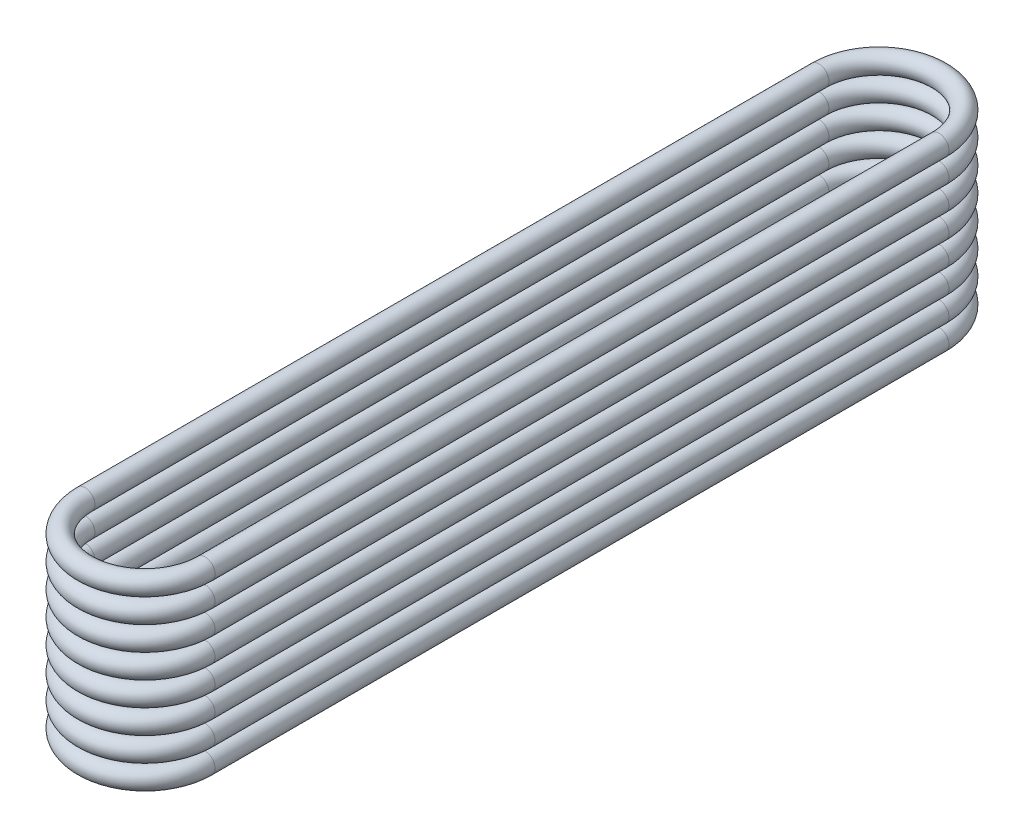
ISO-10303-21;
HEADER;
FILE_DESCRIPTION(('STEP AP214'),'2;1');
FILE_NAME('part.step','',(''),(''),'','','');
FILE_SCHEMA(('AUTOMOTIVE_DESIGN { 1 0 10303 214 1 1 1 1 }'));
ENDSEC;
DATA;
#1=APPLICATION_CONTEXT('core data for automotive mechanical design processes');
#2=APPLICATION_PROTOCOL_DEFINITION('international standard','automotive_design',2000,#1);
#3=PRODUCT_CONTEXT('',#1,'mechanical');
#4=PRODUCT('Part','Part','',(#3));
#5=PRODUCT_RELATED_PRODUCT_CATEGORY('part','',(#4));
#6=PRODUCT_DEFINITION_FORMATION('','',#4);
#7=PRODUCT_DEFINITION_CONTEXT('part definition',#1,'design');
#8=PRODUCT_DEFINITION('design','',#6,#7);
#9=PRODUCT_DEFINITION_SHAPE('','',#8);
#10=(LENGTH_UNIT() NAMED_UNIT(*) SI_UNIT(.MILLI.,.METRE.));
#11=(NAMED_UNIT(*) PLANE_ANGLE_UNIT() SI_UNIT($,.RADIAN.));
#12=(NAMED_UNIT(*) SI_UNIT($,.STERADIAN.) SOLID_ANGLE_UNIT());
#13=UNCERTAINTY_MEASURE_WITH_UNIT(LENGTH_MEASURE(1.E-05),#10,'distance_accuracy_value','');
#14=(GEOMETRIC_REPRESENTATION_CONTEXT(3) GLOBAL_UNCERTAINTY_ASSIGNED_CONTEXT((#13)) GLOBAL_UNIT_ASSIGNED_CONTEXT((#10,
#11,#12)) REPRESENTATION_CONTEXT('',''));
#15=CARTESIAN_POINT('',(0.,0.,0.));
#16=DIRECTION('',(0.,0.,1.));
#17=DIRECTION('',(1.,0.,0.));
#18=AXIS2_PLACEMENT_3D('',#15,#16,#17);
#19=CARTESIAN_POINT('',(2.28600000003875,-0.9144,0.));
#20=DIRECTION('',(0.,0.,-1.));
#21=DIRECTION('',(-1.,0.,0.));
#22=AXIS2_PLACEMENT_3D('',#19,#20,#21);
#23=CYLINDRICAL_SURFACE('',#22,0.381);
#24=CARTESIAN_POINT('',(2.28600000003875,-0.9144,-27.94));
#25=DIRECTION('',(0.,0.,1.));
#26=DIRECTION('',(1.,0.,0.));
#27=AXIS2_PLACEMENT_3D('',#24,#25,#26);
#28=CIRCLE('',#27,0.381);
#29=CARTESIAN_POINT('',(2.66700000003876,-0.9144,-27.94));
#30=VERTEX_POINT('',#29);
#31=EDGE_CURVE('P0_E47',#30,#30,#28,.T.);
#32=ORIENTED_EDGE('',*,*,#31,.T.);
#33=EDGE_LOOP('',(#32));
#34=FACE_BOUND('',#33,.T.);
#35=CARTESIAN_POINT('',(2.28600000003875,-0.9144,0.));
#36=DIRECTION('',(0.,0.,1.));
#37=DIRECTION('',(1.,0.,0.));
#38=AXIS2_PLACEMENT_3D('',#35,#36,#37);
#39=CIRCLE('',#38,0.381);
#40=CARTESIAN_POINT('',(2.66700000003874,-0.9144,0.));
#41=VERTEX_POINT('',#40);
#42=EDGE_CURVE('P0_E11',#41,#41,#39,.T.);
#43=ORIENTED_EDGE('',*,*,#42,.F.);
#44=EDGE_LOOP('',(#43));
#45=FACE_BOUND('',#44,.T.);
#46=ADVANCED_FACE('P0_F17',(#34,#45),#23,.T.);
#47=CARTESIAN_POINT('',(0.,-0.9144,0.));
#48=DIRECTION('',(0.,1.,0.));
#49=DIRECTION('',(0.,0.,1.));
#50=AXIS2_PLACEMENT_3D('',#47,#48,#49);
#51=TOROIDAL_SURFACE('',#50,2.28600000003875,0.381);
#52=ORIENTED_EDGE('',*,*,#42,.T.);
#53=EDGE_LOOP('',(#52));
#54=FACE_BOUND('',#53,.T.);
#55=CARTESIAN_POINT('',(-2.28600000003875,-0.9144,0.));
#56=DIRECTION('',(0.,0.,-1.));
#57=DIRECTION('',(-1.,0.,0.));
#58=AXIS2_PLACEMENT_3D('',#55,#56,#57);
#59=CIRCLE('',#58,0.381);
#60=CARTESIAN_POINT('',(-2.66700000003874,-0.9144,0.));
#61=VERTEX_POINT('',#60);
#62=EDGE_CURVE('P0_E28',#61,#61,#59,.T.);
#63=ORIENTED_EDGE('',*,*,#62,.F.);
#64=EDGE_LOOP('',(#63));
#65=FACE_BOUND('',#64,.T.);
#66=ADVANCED_FACE('P0_F69',(#54,#65),#51,.T.);
#67=CARTESIAN_POINT('',(-2.28600000003875,-0.9144,0.));
#68=DIRECTION('',(0.,0.,-1.));
#69=DIRECTION('',(-1.,0.,0.));
#70=AXIS2_PLACEMENT_3D('',#67,#68,#69);
#71=CYLINDRICAL_SURFACE('',#70,0.381);
#72=CARTESIAN_POINT('',(-2.28600000003875,-0.9144,-27.94));
#73=DIRECTION('',(0.,0.,-1.));
#74=DIRECTION('',(-1.,0.,0.));
#75=AXIS2_PLACEMENT_3D('',#72,#73,#74);
#76=CIRCLE('',#75,0.381);
#77=CARTESIAN_POINT('',(-2.66700000003874,-0.9144,-27.94));
#78=VERTEX_POINT('',#77);
#79=EDGE_CURVE('P0_E21',#78,#78,#76,.T.);
#80=ORIENTED_EDGE('',*,*,#79,.F.);
#81=EDGE_LOOP('',(#80));
#82=FACE_BOUND('',#81,.T.);
#83=ORIENTED_EDGE('',*,*,#62,.T.);
#84=EDGE_LOOP('',(#83));
#85=FACE_BOUND('',#84,.T.);
#86=ADVANCED_FACE('P0_F19',(#82,#85),#71,.T.);
#87=CARTESIAN_POINT('',(0.,-0.9144,-27.94));
#88=DIRECTION('',(0.,-1.,0.));
#89=DIRECTION('',(0.,0.,-1.));
#90=AXIS2_PLACEMENT_3D('',#87,#88,#89);
#91=TOROIDAL_SURFACE('',#90,2.28600000003875,0.381);
#92=ORIENTED_EDGE('',*,*,#31,.F.);
#93=EDGE_LOOP('',(#92));
#94=FACE_BOUND('',#93,.T.);
#95=ORIENTED_EDGE('',*,*,#79,.T.);
#96=EDGE_LOOP('',(#95));
#97=FACE_BOUND('',#96,.T.);
#98=ADVANCED_FACE('P0_F53',(#94,#97),#91,.T.);
#99=CLOSED_SHELL('',(#46,#66,#86,#98));
#100=MANIFOLD_SOLID_BREP('P0_B1',#99);
#101=CARTESIAN_POINT('',(2.28600000003875,-3.6576,0.));
#102=DIRECTION('',(0.,0.,-1.));
#103=DIRECTION('',(-1.,0.,0.));
#104=AXIS2_PLACEMENT_3D('',#101,#102,#103);
#105=CYLINDRICAL_SURFACE('',#104,0.381);
#106=CARTESIAN_POINT('',(2.28600000003875,-3.6576,-27.94));
#107=DIRECTION('',(0.,0.,1.));
#108=DIRECTION('',(1.,0.,0.));
#109=AXIS2_PLACEMENT_3D('',#106,#107,#108);
#110=CIRCLE('',#109,0.381);
#111=CARTESIAN_POINT('',(2.66700000003876,-3.6576,-27.94));
#112=VERTEX_POINT('',#111);
#113=EDGE_CURVE('P1_E21',#112,#112,#110,.T.);
#114=ORIENTED_EDGE('',*,*,#113,.T.);
#115=EDGE_LOOP('',(#114));
#116=FACE_BOUND('',#115,.T.);
#117=CARTESIAN_POINT('',(2.28600000003875,-3.6576,0.));
#118=DIRECTION('',(0.,0.,1.));
#119=DIRECTION('',(1.,0.,0.));
#120=AXIS2_PLACEMENT_3D('',#117,#118,#119);
#121=CIRCLE('',#120,0.381);
#122=CARTESIAN_POINT('',(2.66700000003874,-3.6576,0.));
#123=VERTEX_POINT('',#122);
#124=EDGE_CURVE('P1_E11',#123,#123,#121,.T.);
#125=ORIENTED_EDGE('',*,*,#124,.F.);
#126=EDGE_LOOP('',(#125));
#127=FACE_BOUND('',#126,.T.);
#128=ADVANCED_FACE('P1_F17',(#116,#127),#105,.T.);
#129=CARTESIAN_POINT('',(0.,-3.6576,0.));
#130=DIRECTION('',(0.,1.,0.));
#131=DIRECTION('',(0.,0.,1.));
#132=AXIS2_PLACEMENT_3D('',#129,#130,#131);
#133=TOROIDAL_SURFACE('',#132,2.28600000003875,0.381);
#134=ORIENTED_EDGE('',*,*,#124,.T.);
#135=EDGE_LOOP('',(#134));
#136=FACE_BOUND('',#135,.T.);
#137=CARTESIAN_POINT('',(-2.28600000003875,-3.6576,0.));
#138=DIRECTION('',(0.,0.,-1.));
#139=DIRECTION('',(-1.,0.,0.));
#140=AXIS2_PLACEMENT_3D('',#137,#138,#139);
#141=CIRCLE('',#140,0.381);
#142=CARTESIAN_POINT('',(-2.66700000003874,-3.6576,0.));
#143=VERTEX_POINT('',#142);
#144=EDGE_CURVE('P1_E28',#143,#143,#141,.T.);
#145=ORIENTED_EDGE('',*,*,#144,.F.);
#146=EDGE_LOOP('',(#145));
#147=FACE_BOUND('',#146,.T.);
#148=ADVANCED_FACE('P1_F68',(#136,#147),#133,.T.);
#149=CARTESIAN_POINT('',(-2.28600000003875,-3.6576,0.));
#150=DIRECTION('',(0.,0.,-1.));
#151=DIRECTION('',(-1.,0.,0.));
#152=AXIS2_PLACEMENT_3D('',#149,#150,#151);
#153=CYLINDRICAL_SURFACE('',#152,0.381);
#154=CARTESIAN_POINT('',(-2.28600000003875,-3.6576,-27.94));
#155=DIRECTION('',(0.,0.,-1.));
#156=DIRECTION('',(-1.,0.,0.));
#157=AXIS2_PLACEMENT_3D('',#154,#155,#156);
#158=CIRCLE('',#157,0.381);
#159=CARTESIAN_POINT('',(-2.66700000003874,-3.6576,-27.94));
#160=VERTEX_POINT('',#159);
#161=EDGE_CURVE('P1_E52',#160,#160,#158,.T.);
#162=ORIENTED_EDGE('',*,*,#161,.F.);
#163=EDGE_LOOP('',(#162));
#164=FACE_BOUND('',#163,.T.);
#165=ORIENTED_EDGE('',*,*,#144,.T.);
#166=EDGE_LOOP('',(#165));
#167=FACE_BOUND('',#166,.T.);
#168=ADVANCED_FACE('P1_F66',(#164,#167),#153,.T.);
#169=CARTESIAN_POINT('',(0.,-3.6576,-27.94));
#170=DIRECTION('',(0.,-1.,0.));
#171=DIRECTION('',(0.,0.,-1.));
#172=AXIS2_PLACEMENT_3D('',#169,#170,#171);
#173=TOROIDAL_SURFACE('',#172,2.28600000003875,0.381);
#174=ORIENTED_EDGE('',*,*,#113,.F.);
#175=EDGE_LOOP('',(#174));
#176=FACE_BOUND('',#175,.T.);
#177=ORIENTED_EDGE('',*,*,#161,.T.);
#178=EDGE_LOOP('',(#177));
#179=FACE_BOUND('',#178,.T.);
#180=ADVANCED_FACE('P1_F19',(#176,#179),#173,.T.);
#181=CLOSED_SHELL('',(#128,#148,#168,#180));
#182=MANIFOLD_SOLID_BREP('P1_B1',#181);
#183=CARTESIAN_POINT('',(2.28600000003875,-1.8288,0.));
#184=DIRECTION('',(0.,0.,-1.));
#185=DIRECTION('',(-1.,0.,0.));
#186=AXIS2_PLACEMENT_3D('',#183,#184,#185);
#187=CYLINDRICAL_SURFACE('',#186,0.381);
#188=CARTESIAN_POINT('',(2.28600000003875,-1.8288,-27.94));
#189=DIRECTION('',(0.,0.,1.));
#190=DIRECTION('',(1.,0.,0.));
#191=AXIS2_PLACEMENT_3D('',#188,#189,#190);
#192=CIRCLE('',#191,0.381);
#193=CARTESIAN_POINT('',(2.66700000003876,-1.8288,-27.94));
#194=VERTEX_POINT('',#193);
#195=EDGE_CURVE('P2_E44',#194,#194,#192,.T.);
#196=ORIENTED_EDGE('',*,*,#195,.T.);
#197=EDGE_LOOP('',(#196));
#198=FACE_BOUND('',#197,.T.);
#199=CARTESIAN_POINT('',(2.28600000003875,-1.8288,0.));
#200=DIRECTION('',(0.,0.,1.));
#201=DIRECTION('',(1.,0.,0.));
#202=AXIS2_PLACEMENT_3D('',#199,#200,#201);
#203=CIRCLE('',#202,0.381);
#204=CARTESIAN_POINT('',(2.66700000003874,-1.8288,0.));
#205=VERTEX_POINT('',#204);
#206=EDGE_CURVE('P2_E11',#205,#205,#203,.T.);
#207=ORIENTED_EDGE('',*,*,#206,.F.);
#208=EDGE_LOOP('',(#207));
#209=FACE_BOUND('',#208,.T.);
#210=ADVANCED_FACE('P2_F17',(#198,#209),#187,.T.);
#211=CARTESIAN_POINT('',(0.,-1.8288,0.));
#212=DIRECTION('',(0.,1.,0.));
#213=DIRECTION('',(0.,0.,1.));
#214=AXIS2_PLACEMENT_3D('',#211,#212,#213);
#215=TOROIDAL_SURFACE('',#214,2.28600000003875,0.381);
#216=ORIENTED_EDGE('',*,*,#206,.T.);
#217=EDGE_LOOP('',(#216));
#218=FACE_BOUND('',#217,.T.);
#219=CARTESIAN_POINT('',(-2.28600000003875,-1.8288,0.));
#220=DIRECTION('',(0.,0.,-1.));
#221=DIRECTION('',(-1.,0.,0.));
#222=AXIS2_PLACEMENT_3D('',#219,#220,#221);
#223=CIRCLE('',#222,0.381);
#224=CARTESIAN_POINT('',(-2.66700000003874,-1.8288,0.));
#225=VERTEX_POINT('',#224);
#226=EDGE_CURVE('P2_E20',#225,#225,#223,.T.);
#227=ORIENTED_EDGE('',*,*,#226,.F.);
#228=EDGE_LOOP('',(#227));
#229=FACE_BOUND('',#228,.T.);
#230=ADVANCED_FACE('P2_F69',(#218,#229),#215,.T.);
#231=CARTESIAN_POINT('',(-2.28600000003875,-1.8288,0.));
#232=DIRECTION('',(0.,0.,-1.));
#233=DIRECTION('',(-1.,0.,0.));
#234=AXIS2_PLACEMENT_3D('',#231,#232,#233);
#235=CYLINDRICAL_SURFACE('',#234,0.381);
#236=CARTESIAN_POINT('',(-2.28600000003875,-1.8288,-27.94));
#237=DIRECTION('',(0.,0.,-1.));
#238=DIRECTION('',(-1.,0.,0.));
#239=AXIS2_PLACEMENT_3D('',#236,#237,#238);
#240=CIRCLE('',#239,0.381);
#241=CARTESIAN_POINT('',(-2.66700000003874,-1.8288,-27.94));
#242=VERTEX_POINT('',#241);
#243=EDGE_CURVE('P2_E50',#242,#242,#240,.T.);
#244=ORIENTED_EDGE('',*,*,#243,.F.);
#245=EDGE_LOOP('',(#244));
#246=FACE_BOUND('',#245,.T.);
#247=ORIENTED_EDGE('',*,*,#226,.T.);
#248=EDGE_LOOP('',(#247));
#249=FACE_BOUND('',#248,.T.);
#250=ADVANCED_FACE('P2_F67',(#246,#249),#235,.T.);
#251=CARTESIAN_POINT('',(0.,-1.8288,-27.94));
#252=DIRECTION('',(0.,-1.,0.));
#253=DIRECTION('',(0.,0.,-1.));
#254=AXIS2_PLACEMENT_3D('',#251,#252,#253);
#255=TOROIDAL_SURFACE('',#254,2.28600000003875,0.381);
#256=ORIENTED_EDGE('',*,*,#195,.F.);
#257=EDGE_LOOP('',(#256));
#258=FACE_BOUND('',#257,.T.);
#259=ORIENTED_EDGE('',*,*,#243,.T.);
#260=EDGE_LOOP('',(#259));
#261=FACE_BOUND('',#260,.T.);
#262=ADVANCED_FACE('P2_F51',(#258,#261),#255,.T.);
#263=CLOSED_SHELL('',(#210,#230,#250,#262));
#264=MANIFOLD_SOLID_BREP('P2_B1',#263);
#265=CARTESIAN_POINT('',(2.28600000003875,-5.4864,0.));
#266=DIRECTION('',(0.,0.,-1.));
#267=DIRECTION('',(-1.,0.,0.));
#268=AXIS2_PLACEMENT_3D('',#265,#266,#267);
#269=CYLINDRICAL_SURFACE('',#268,0.381);
#270=CARTESIAN_POINT('',(2.28600000003875,-5.4864,-27.94));
#271=DIRECTION('',(0.,0.,1.));
#272=DIRECTION('',(1.,0.,0.));
#273=AXIS2_PLACEMENT_3D('',#270,#271,#272);
#274=CIRCLE('',#273,0.381);
#275=CARTESIAN_POINT('',(2.66700000003876,-5.4864,-27.94));
#276=VERTEX_POINT('',#275);
#277=EDGE_CURVE('P3_E51',#276,#276,#274,.T.);
#278=ORIENTED_EDGE('',*,*,#277,.T.);
#279=EDGE_LOOP('',(#278));
#280=FACE_BOUND('',#279,.T.);
#281=CARTESIAN_POINT('',(2.28600000003875,-5.4864,0.));
#282=DIRECTION('',(0.,0.,1.));
#283=DIRECTION('',(1.,0.,0.));
#284=AXIS2_PLACEMENT_3D('',#281,#282,#283);
#285=CIRCLE('',#284,0.381);
#286=CARTESIAN_POINT('',(2.66700000003874,-5.4864,0.));
#287=VERTEX_POINT('',#286);
#288=EDGE_CURVE('P3_E11',#287,#287,#285,.T.);
#289=ORIENTED_EDGE('',*,*,#288,.F.);
#290=EDGE_LOOP('',(#289));
#291=FACE_BOUND('',#290,.T.);
#292=ADVANCED_FACE('P3_F17',(#280,#291),#269,.T.);
#293=CARTESIAN_POINT('',(0.,-5.4864,0.));
#294=DIRECTION('',(0.,1.,0.));
#295=DIRECTION('',(0.,0.,1.));
#296=AXIS2_PLACEMENT_3D('',#293,#294,#295);
#297=TOROIDAL_SURFACE('',#296,2.28600000003875,0.381);
#298=ORIENTED_EDGE('',*,*,#288,.T.);
#299=EDGE_LOOP('',(#298));
#300=FACE_BOUND('',#299,.T.);
#301=CARTESIAN_POINT('',(-2.28600000003875,-5.4864,0.));
#302=DIRECTION('',(0.,0.,-1.));
#303=DIRECTION('',(-1.,0.,0.));
#304=AXIS2_PLACEMENT_3D('',#301,#302,#303);
#305=CIRCLE('',#304,0.381);
#306=CARTESIAN_POINT('',(-2.66700000003874,-5.4864,0.));
#307=VERTEX_POINT('',#306);
#308=EDGE_CURVE('P3_E27',#307,#307,#305,.T.);
#309=ORIENTED_EDGE('',*,*,#308,.F.);
#310=EDGE_LOOP('',(#309));
#311=FACE_BOUND('',#310,.T.);
#312=ADVANCED_FACE('P3_F19',(#300,#311),#297,.T.);
#313=CARTESIAN_POINT('',(-2.28600000003875,-5.4864,0.));
#314=DIRECTION('',(0.,0.,-1.));
#315=DIRECTION('',(-1.,0.,0.));
#316=AXIS2_PLACEMENT_3D('',#313,#314,#315);
#317=CYLINDRICAL_SURFACE('',#316,0.381);
#318=CARTESIAN_POINT('',(-2.28600000003875,-5.4864,-27.94));
#319=DIRECTION('',(0.,0.,-1.));
#320=DIRECTION('',(-1.,0.,0.));
#321=AXIS2_PLACEMENT_3D('',#318,#319,#320);
#322=CIRCLE('',#321,0.381);
#323=CARTESIAN_POINT('',(-2.66700000003874,-5.4864,-27.94));
#324=VERTEX_POINT('',#323);
#325=EDGE_CURVE('P3_E47',#324,#324,#322,.T.);
#326=ORIENTED_EDGE('',*,*,#325,.F.);
#327=EDGE_LOOP('',(#326));
#328=FACE_BOUND('',#327,.T.);
#329=ORIENTED_EDGE('',*,*,#308,.T.);
#330=EDGE_LOOP('',(#329));
#331=FACE_BOUND('',#330,.T.);
#332=ADVANCED_FACE('P3_F63',(#328,#331),#317,.T.);
#333=CARTESIAN_POINT('',(0.,-5.4864,-27.94));
#334=DIRECTION('',(0.,-1.,0.));
#335=DIRECTION('',(0.,0.,-1.));
#336=AXIS2_PLACEMENT_3D('',#333,#334,#335);
#337=TOROIDAL_SURFACE('',#336,2.28600000003875,0.381);
#338=ORIENTED_EDGE('',*,*,#277,.F.);
#339=EDGE_LOOP('',(#338));
#340=FACE_BOUND('',#339,.T.);
#341=ORIENTED_EDGE('',*,*,#325,.T.);
#342=EDGE_LOOP('',(#341));
#343=FACE_BOUND('',#342,.T.);
#344=ADVANCED_FACE('P3_F48',(#340,#343),#337,.T.);
#345=CLOSED_SHELL('',(#292,#312,#332,#344));
#346=MANIFOLD_SOLID_BREP('P3_B1',#345);
#347=CARTESIAN_POINT('',(2.28600000003875,0.,0.));
#348=DIRECTION('',(0.,0.,-1.));
#349=DIRECTION('',(-1.,0.,0.));
#350=AXIS2_PLACEMENT_3D('',#347,#348,#349);
#351=CYLINDRICAL_SURFACE('',#350,0.381);
#352=CARTESIAN_POINT('',(2.28600000003875,0.,-27.94));
#353=DIRECTION('',(0.,0.,1.));
#354=DIRECTION('',(1.,0.,0.));
#355=AXIS2_PLACEMENT_3D('',#352,#353,#354);
#356=CIRCLE('',#355,0.381);
#357=CARTESIAN_POINT('',(2.66700000003876,0.,-27.94));
#358=VERTEX_POINT('',#357);
#359=EDGE_CURVE('P4_E21',#358,#358,#356,.T.);
#360=ORIENTED_EDGE('',*,*,#359,.T.);
#361=EDGE_LOOP('',(#360));
#362=FACE_BOUND('',#361,.T.);
#363=CARTESIAN_POINT('',(2.28600000003875,0.,0.));
#364=DIRECTION('',(0.,0.,1.));
#365=DIRECTION('',(1.,0.,0.));
#366=AXIS2_PLACEMENT_3D('',#363,#364,#365);
#367=CIRCLE('',#366,0.381);
#368=CARTESIAN_POINT('',(2.66700000003874,0.,0.));
#369=VERTEX_POINT('',#368);
#370=EDGE_CURVE('P4_E11',#369,#369,#367,.T.);
#371=ORIENTED_EDGE('',*,*,#370,.F.);
#372=EDGE_LOOP('',(#371));
#373=FACE_BOUND('',#372,.T.);
#374=ADVANCED_FACE('P4_F17',(#362,#373),#351,.T.);
#375=CARTESIAN_POINT('',(0.,0.,0.));
#376=DIRECTION('',(0.,1.,0.));
#377=DIRECTION('',(0.,0.,1.));
#378=AXIS2_PLACEMENT_3D('',#375,#376,#377);
#379=TOROIDAL_SURFACE('',#378,2.28600000003875,0.381);
#380=ORIENTED_EDGE('',*,*,#370,.T.);
#381=EDGE_LOOP('',(#380));
#382=FACE_BOUND('',#381,.T.);
#383=CARTESIAN_POINT('',(-2.28600000003875,0.,0.));
#384=DIRECTION('',(0.,0.,-1.));
#385=DIRECTION('',(-1.,0.,0.));
#386=AXIS2_PLACEMENT_3D('',#383,#384,#385);
#387=CIRCLE('',#386,0.381);
#388=CARTESIAN_POINT('',(-2.66700000003874,0.,0.));
#389=VERTEX_POINT('',#388);
#390=EDGE_CURVE('P4_E27',#389,#389,#387,.T.);
#391=ORIENTED_EDGE('',*,*,#390,.F.);
#392=EDGE_LOOP('',(#391));
#393=FACE_BOUND('',#392,.T.);
#394=ADVANCED_FACE('P4_F79',(#382,#393),#379,.T.);
#395=CARTESIAN_POINT('',(-2.28600000003875,0.,0.));
#396=DIRECTION('',(0.,0.,-1.));
#397=DIRECTION('',(-1.,0.,0.));
#398=AXIS2_PLACEMENT_3D('',#395,#396,#397);
#399=CYLINDRICAL_SURFACE('',#398,0.381);
#400=CARTESIAN_POINT('',(-2.28600000003875,0.,-27.94));
#401=DIRECTION('',(0.,0.,-1.));
#402=DIRECTION('',(-1.,0.,0.));
#403=AXIS2_PLACEMENT_3D('',#400,#401,#402);
#404=CIRCLE('',#403,0.381);
#405=CARTESIAN_POINT('',(-2.66700000003874,0.,-27.94));
#406=VERTEX_POINT('',#405);
#407=EDGE_CURVE('P4_E51',#406,#406,#404,.T.);
#408=ORIENTED_EDGE('',*,*,#407,.F.);
#409=EDGE_LOOP('',(#408));
#410=FACE_BOUND('',#409,.T.);
#411=ORIENTED_EDGE('',*,*,#390,.T.);
#412=EDGE_LOOP('',(#411));
#413=FACE_BOUND('',#412,.T.);
#414=ADVANCED_FACE('P4_F88',(#410,#413),#399,.T.);
#415=CARTESIAN_POINT('',(0.,0.,-27.94));
#416=DIRECTION('',(0.,-1.,0.));
#417=DIRECTION('',(0.,0.,-1.));
#418=AXIS2_PLACEMENT_3D('',#415,#416,#417);
#419=TOROIDAL_SURFACE('',#418,2.28600000003875,0.381);
#420=ORIENTED_EDGE('',*,*,#359,.F.);
#421=EDGE_LOOP('',(#420));
#422=FACE_BOUND('',#421,.T.);
#423=ORIENTED_EDGE('',*,*,#407,.T.);
#424=EDGE_LOOP('',(#423));
#425=FACE_BOUND('',#424,.T.);
#426=ADVANCED_FACE('P4_F19',(#422,#425),#419,.T.);
#427=CLOSED_SHELL('',(#374,#394,#414,#426));
#428=MANIFOLD_SOLID_BREP('P4_B1',#427);
#429=CARTESIAN_POINT('',(2.28600000003875,-4.572,0.));
#430=DIRECTION('',(0.,0.,-1.));
#431=DIRECTION('',(-1.,0.,0.));
#432=AXIS2_PLACEMENT_3D('',#429,#430,#431);
#433=CYLINDRICAL_SURFACE('',#432,0.381);
#434=CARTESIAN_POINT('',(2.28600000003875,-4.572,-27.94));
#435=DIRECTION('',(0.,0.,1.));
#436=DIRECTION('',(1.,0.,0.));
#437=AXIS2_PLACEMENT_3D('',#434,#435,#436);
#438=CIRCLE('',#437,0.381);
#439=CARTESIAN_POINT('',(2.66700000003876,-4.572,-27.94));
#440=VERTEX_POINT('',#439);
#441=EDGE_CURVE('P5_E54',#440,#440,#438,.T.);
#442=ORIENTED_EDGE('',*,*,#441,.T.);
#443=EDGE_LOOP('',(#442));
#444=FACE_BOUND('',#443,.T.);
#445=CARTESIAN_POINT('',(2.28600000003875,-4.572,0.));
#446=DIRECTION('',(0.,0.,1.));
#447=DIRECTION('',(1.,0.,0.));
#448=AXIS2_PLACEMENT_3D('',#445,#446,#447);
#449=CIRCLE('',#448,0.381);
#450=CARTESIAN_POINT('',(2.66700000003874,-4.572,0.));
#451=VERTEX_POINT('',#450);
#452=EDGE_CURVE('P5_E11',#451,#451,#449,.T.);
#453=ORIENTED_EDGE('',*,*,#452,.F.);
#454=EDGE_LOOP('',(#453));
#455=FACE_BOUND('',#454,.T.);
#456=ADVANCED_FACE('P5_F17',(#444,#455),#433,.T.);
#457=CARTESIAN_POINT('',(0.,-4.572,0.));
#458=DIRECTION('',(0.,1.,0.));
#459=DIRECTION('',(0.,0.,1.));
#460=AXIS2_PLACEMENT_3D('',#457,#458,#459);
#461=TOROIDAL_SURFACE('',#460,2.28600000003875,0.381);
#462=ORIENTED_EDGE('',*,*,#452,.T.);
#463=EDGE_LOOP('',(#462));
#464=FACE_BOUND('',#463,.T.);
#465=CARTESIAN_POINT('',(-2.28600000003875,-4.572,0.));
#466=DIRECTION('',(0.,0.,-1.));
#467=DIRECTION('',(-1.,0.,0.));
#468=AXIS2_PLACEMENT_3D('',#465,#466,#467);
#469=CIRCLE('',#468,0.381);
#470=CARTESIAN_POINT('',(-2.66700000003874,-4.572,0.));
#471=VERTEX_POINT('',#470);
#472=EDGE_CURVE('P5_E27',#471,#471,#469,.T.);
#473=ORIENTED_EDGE('',*,*,#472,.F.);
#474=EDGE_LOOP('',(#473));
#475=FACE_BOUND('',#474,.T.);
#476=ADVANCED_FACE('P5_F89',(#464,#475),#461,.T.);
#477=CARTESIAN_POINT('',(-2.28600000003875,-4.572,0.));
#478=DIRECTION('',(0.,0.,-1.));
#479=DIRECTION('',(-1.,0.,0.));
#480=AXIS2_PLACEMENT_3D('',#477,#478,#479);
#481=CYLINDRICAL_SURFACE('',#480,0.381);
#482=CARTESIAN_POINT('',(-2.28600000003875,-4.572,-27.94));
#483=DIRECTION('',(0.,0.,-1.));
#484=DIRECTION('',(-1.,0.,0.));
#485=AXIS2_PLACEMENT_3D('',#482,#483,#484);
#486=CIRCLE('',#485,0.381);
#487=CARTESIAN_POINT('',(-2.66700000003874,-4.572,-27.94));
#488=VERTEX_POINT('',#487);
#489=EDGE_CURVE('P5_E21',#488,#488,#486,.T.);
#490=ORIENTED_EDGE('',*,*,#489,.F.);
#491=EDGE_LOOP('',(#490));
#492=FACE_BOUND('',#491,.T.);
#493=ORIENTED_EDGE('',*,*,#472,.T.);
#494=EDGE_LOOP('',(#493));
#495=FACE_BOUND('',#494,.T.);
#496=ADVANCED_FACE('P5_F78',(#492,#495),#481,.T.);
#497=CARTESIAN_POINT('',(0.,-4.572,-27.94));
#498=DIRECTION('',(0.,-1.,0.));
#499=DIRECTION('',(0.,0.,-1.));
#500=AXIS2_PLACEMENT_3D('',#497,#498,#499);
#501=TOROIDAL_SURFACE('',#500,2.28600000003875,0.381);
#502=ORIENTED_EDGE('',*,*,#441,.F.);
#503=EDGE_LOOP('',(#502));
#504=FACE_BOUND('',#503,.T.);
#505=ORIENTED_EDGE('',*,*,#489,.T.);
#506=EDGE_LOOP('',(#505));
#507=FACE_BOUND('',#506,.T.);
#508=ADVANCED_FACE('P5_F19',(#504,#507),#501,.T.);
#509=CLOSED_SHELL('',(#456,#476,#496,#508));
#510=MANIFOLD_SOLID_BREP('P5_B1',#509);
#511=CARTESIAN_POINT('',(2.28600000003875,-6.4008,0.));
#512=DIRECTION('',(0.,0.,-1.));
#513=DIRECTION('',(-1.,0.,0.));
#514=AXIS2_PLACEMENT_3D('',#511,#512,#513);
#515=CYLINDRICAL_SURFACE('',#514,0.381);
#516=CARTESIAN_POINT('',(2.28600000003875,-6.4008,-27.94));
#517=DIRECTION('',(0.,0.,1.));
#518=DIRECTION('',(1.,0.,0.));
#519=AXIS2_PLACEMENT_3D('',#516,#517,#518);
#520=CIRCLE('',#519,0.381);
#521=CARTESIAN_POINT('',(2.66700000003876,-6.4008,-27.94));
#522=VERTEX_POINT('',#521);
#523=EDGE_CURVE('P6_E20',#522,#522,#520,.T.);
#524=ORIENTED_EDGE('',*,*,#523,.T.);
#525=EDGE_LOOP('',(#524));
#526=FACE_BOUND('',#525,.T.);
#527=CARTESIAN_POINT('',(2.28600000003875,-6.4008,0.));
#528=DIRECTION('',(0.,0.,1.));
#529=DIRECTION('',(1.,0.,0.));
#530=AXIS2_PLACEMENT_3D('',#527,#528,#529);
#531=CIRCLE('',#530,0.381);
#532=CARTESIAN_POINT('',(2.66700000003874,-6.4008,0.));
#533=VERTEX_POINT('',#532);
#534=EDGE_CURVE('P6_E11',#533,#533,#531,.T.);
#535=ORIENTED_EDGE('',*,*,#534,.F.);
#536=EDGE_LOOP('',(#535));
#537=FACE_BOUND('',#536,.T.);
#538=ADVANCED_FACE('P6_F17',(#526,#537),#515,.T.);
#539=CARTESIAN_POINT('',(0.,-6.4008,0.));
#540=DIRECTION('',(0.,1.,0.));
#541=DIRECTION('',(0.,0.,1.));
#542=AXIS2_PLACEMENT_3D('',#539,#540,#541);
#543=TOROIDAL_SURFACE('',#542,2.28600000003875,0.381);
#544=ORIENTED_EDGE('',*,*,#534,.T.);
#545=EDGE_LOOP('',(#544));
#546=FACE_BOUND('',#545,.T.);
#547=CARTESIAN_POINT('',(-2.28600000003875,-6.4008,0.));
#548=DIRECTION('',(0.,0.,-1.));
#549=DIRECTION('',(-1.,0.,0.));
#550=AXIS2_PLACEMENT_3D('',#547,#548,#549);
#551=CIRCLE('',#550,0.381);
#552=CARTESIAN_POINT('',(-2.66700000003874,-6.4008,0.));
#553=VERTEX_POINT('',#552);
#554=EDGE_CURVE('P6_E26',#553,#553,#551,.T.);
#555=ORIENTED_EDGE('',*,*,#554,.F.);
#556=EDGE_LOOP('',(#555));
#557=FACE_BOUND('',#556,.T.);
#558=ADVANCED_FACE('P6_F87',(#546,#557),#543,.T.);
#559=CARTESIAN_POINT('',(-2.28600000003875,-6.4008,0.));
#560=DIRECTION('',(0.,0.,-1.));
#561=DIRECTION('',(-1.,0.,0.));
#562=AXIS2_PLACEMENT_3D('',#559,#560,#561);
#563=CYLINDRICAL_SURFACE('',#562,0.381);
#564=CARTESIAN_POINT('',(-2.28600000003875,-6.4008,-27.94));
#565=DIRECTION('',(0.,0.,-1.));
#566=DIRECTION('',(-1.,0.,0.));
#567=AXIS2_PLACEMENT_3D('',#564,#565,#566);
#568=CIRCLE('',#567,0.381);
#569=CARTESIAN_POINT('',(-2.66700000003874,-6.4008,-27.94));
#570=VERTEX_POINT('',#569);
#571=EDGE_CURVE('P6_E52',#570,#570,#568,.T.);
#572=ORIENTED_EDGE('',*,*,#571,.F.);
#573=EDGE_LOOP('',(#572));
#574=FACE_BOUND('',#573,.T.);
#575=ORIENTED_EDGE('',*,*,#554,.T.);
#576=EDGE_LOOP('',(#575));
#577=FACE_BOUND('',#576,.T.);
#578=ADVANCED_FACE('P6_F78',(#574,#577),#563,.T.);
#579=CARTESIAN_POINT('',(0.,-6.4008,-27.94));
#580=DIRECTION('',(0.,-1.,0.));
#581=DIRECTION('',(0.,0.,-1.));
#582=AXIS2_PLACEMENT_3D('',#579,#580,#581);
#583=TOROIDAL_SURFACE('',#582,2.28600000003875,0.381);
#584=ORIENTED_EDGE('',*,*,#523,.F.);
#585=EDGE_LOOP('',(#584));
#586=FACE_BOUND('',#585,.T.);
#587=ORIENTED_EDGE('',*,*,#571,.T.);
#588=EDGE_LOOP('',(#587));
#589=FACE_BOUND('',#588,.T.);
#590=ADVANCED_FACE('P6_F53',(#586,#589),#583,.T.);
#591=CLOSED_SHELL('',(#538,#558,#578,#590));
#592=MANIFOLD_SOLID_BREP('P6_B1',#591);
#593=CARTESIAN_POINT('',(2.28600000003875,-2.7432,0.));
#594=DIRECTION('',(0.,0.,-1.));
#595=DIRECTION('',(-1.,0.,0.));
#596=AXIS2_PLACEMENT_3D('',#593,#594,#595);
#597=CYLINDRICAL_SURFACE('',#596,0.381);
#598=CARTESIAN_POINT('',(2.28600000003875,-2.7432,-27.94));
#599=DIRECTION('',(0.,0.,1.));
#600=DIRECTION('',(1.,0.,0.));
#601=AXIS2_PLACEMENT_3D('',#598,#599,#600);
#602=CIRCLE('',#601,0.381);
#603=CARTESIAN_POINT('',(2.66700000003876,-2.7432,-27.94));
#604=VERTEX_POINT('',#603);
#605=EDGE_CURVE('P7_E54',#604,#604,#602,.T.);
#606=ORIENTED_EDGE('',*,*,#605,.T.);
#607=EDGE_LOOP('',(#606));
#608=FACE_BOUND('',#607,.T.);
#609=CARTESIAN_POINT('',(2.28600000003875,-2.7432,0.));
#610=DIRECTION('',(0.,0.,1.));
#611=DIRECTION('',(1.,0.,0.));
#612=AXIS2_PLACEMENT_3D('',#609,#610,#611);
#613=CIRCLE('',#612,0.381);
#614=CARTESIAN_POINT('',(2.66700000003874,-2.7432,0.));
#615=VERTEX_POINT('',#614);
#616=EDGE_CURVE('P7_E11',#615,#615,#613,.T.);
#617=ORIENTED_EDGE('',*,*,#616,.F.);
#618=EDGE_LOOP('',(#617));
#619=FACE_BOUND('',#618,.T.);
#620=ADVANCED_FACE('P7_F17',(#608,#619),#597,.T.);
#621=CARTESIAN_POINT('',(0.,-2.7432,0.));
#622=DIRECTION('',(0.,1.,0.));
#623=DIRECTION('',(0.,0.,1.));
#624=AXIS2_PLACEMENT_3D('',#621,#622,#623);
#625=TOROIDAL_SURFACE('',#624,2.28600000003875,0.381);
#626=ORIENTED_EDGE('',*,*,#616,.T.);
#627=EDGE_LOOP('',(#626));
#628=FACE_BOUND('',#627,.T.);
#629=CARTESIAN_POINT('',(-2.28600000003875,-2.7432,0.));
#630=DIRECTION('',(0.,0.,-1.));
#631=DIRECTION('',(-1.,0.,0.));
#632=AXIS2_PLACEMENT_3D('',#629,#630,#631);
#633=CIRCLE('',#632,0.381);
#634=CARTESIAN_POINT('',(-2.66700000003874,-2.7432,0.));
#635=VERTEX_POINT('',#634);
#636=EDGE_CURVE('P7_E21',#635,#635,#633,.T.);
#637=ORIENTED_EDGE('',*,*,#636,.F.);
#638=EDGE_LOOP('',(#637));
#639=FACE_BOUND('',#638,.T.);
#640=ADVANCED_FACE('P7_F90',(#628,#639),#625,.T.);
#641=CARTESIAN_POINT('',(-2.28600000003875,-2.7432,0.));
#642=DIRECTION('',(0.,0.,-1.));
#643=DIRECTION('',(-1.,0.,0.));
#644=AXIS2_PLACEMENT_3D('',#641,#642,#643);
#645=CYLINDRICAL_SURFACE('',#644,0.381);
#646=CARTESIAN_POINT('',(-2.28600000003875,-2.7432,-27.94));
#647=DIRECTION('',(0.,0.,-1.));
#648=DIRECTION('',(-1.,0.,0.));
#649=AXIS2_PLACEMENT_3D('',#646,#647,#648);
#650=CIRCLE('',#649,0.381);
#651=CARTESIAN_POINT('',(-2.66700000003874,-2.7432,-27.94));
#652=VERTEX_POINT('',#651);
#653=EDGE_CURVE('P7_E50',#652,#652,#650,.T.);
#654=ORIENTED_EDGE('',*,*,#653,.F.);
#655=EDGE_LOOP('',(#654));
#656=FACE_BOUND('',#655,.T.);
#657=ORIENTED_EDGE('',*,*,#636,.T.);
#658=EDGE_LOOP('',(#657));
#659=FACE_BOUND('',#658,.T.);
#660=ADVANCED_FACE('P7_F19',(#656,#659),#645,.T.);
#661=CARTESIAN_POINT('',(0.,-2.7432,-27.94));
#662=DIRECTION('',(0.,-1.,0.));
#663=DIRECTION('',(0.,0.,-1.));
#664=AXIS2_PLACEMENT_3D('',#661,#662,#663);
#665=TOROIDAL_SURFACE('',#664,2.28600000003875,0.381);
#666=ORIENTED_EDGE('',*,*,#605,.F.);
#667=EDGE_LOOP('',(#666));
#668=FACE_BOUND('',#667,.T.);
#669=ORIENTED_EDGE('',*,*,#653,.T.);
#670=EDGE_LOOP('',(#669));
#671=FACE_BOUND('',#670,.T.);
#672=ADVANCED_FACE('P7_F51',(#668,#671),#665,.T.);
#673=CLOSED_SHELL('',(#620,#640,#660,#672));
#674=MANIFOLD_SOLID_BREP('P7_B1',#673);
#675=ADVANCED_BREP_SHAPE_REPRESENTATION('',(#18,#100,#182,#264,#346,#428,#510,#592,#674),#14);
#676=SHAPE_DEFINITION_REPRESENTATION(#9,#675);
ENDSEC;
END-ISO-10303-21;
